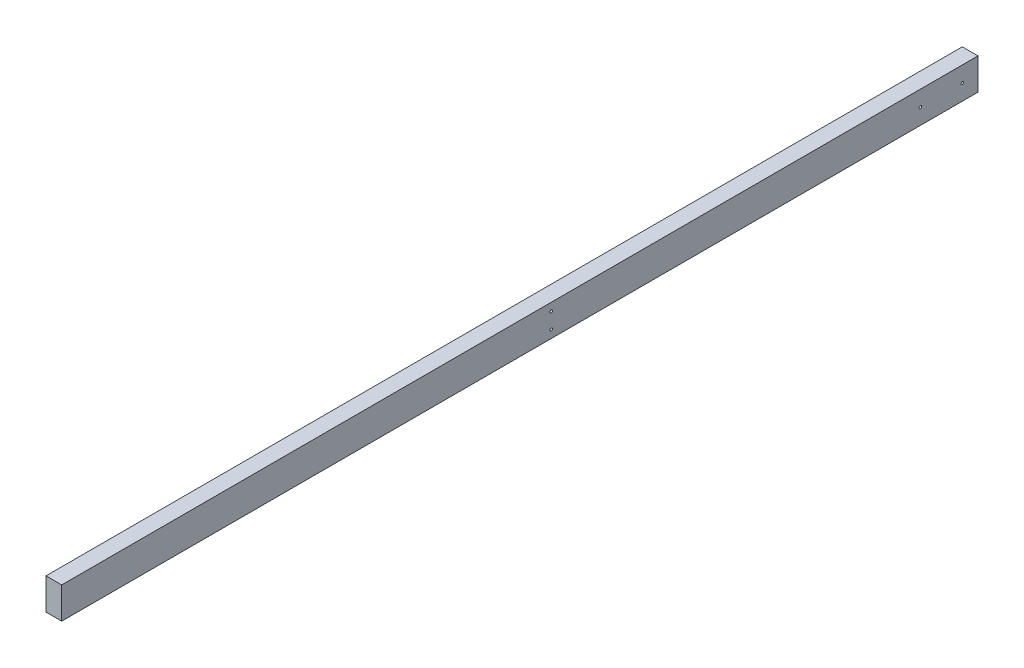
ISO-10303-21;
HEADER;
FILE_DESCRIPTION(('STEP AP214'),'2;1');
FILE_NAME('part.step','',(''),(''),'','','');
FILE_SCHEMA(('AUTOMOTIVE_DESIGN { 1 0 10303 214 1 1 1 1 }'));
ENDSEC;
DATA;
#1=APPLICATION_CONTEXT('core data for automotive mechanical design processes');
#2=APPLICATION_PROTOCOL_DEFINITION('international standard','automotive_design',2000,#1);
#3=PRODUCT_CONTEXT('',#1,'mechanical');
#4=PRODUCT('Part','Part','',(#3));
#5=PRODUCT_RELATED_PRODUCT_CATEGORY('part','',(#4));
#6=PRODUCT_DEFINITION_FORMATION('','',#4);
#7=PRODUCT_DEFINITION_CONTEXT('part definition',#1,'design');
#8=PRODUCT_DEFINITION('design','',#6,#7);
#9=PRODUCT_DEFINITION_SHAPE('','',#8);
#10=(LENGTH_UNIT() NAMED_UNIT(*) SI_UNIT(.MILLI.,.METRE.));
#11=(NAMED_UNIT(*) PLANE_ANGLE_UNIT() SI_UNIT($,.RADIAN.));
#12=(NAMED_UNIT(*) SI_UNIT($,.STERADIAN.) SOLID_ANGLE_UNIT());
#13=UNCERTAINTY_MEASURE_WITH_UNIT(LENGTH_MEASURE(1.E-05),#10,'distance_accuracy_value','');
#14=(GEOMETRIC_REPRESENTATION_CONTEXT(3) GLOBAL_UNCERTAINTY_ASSIGNED_CONTEXT((#13)) GLOBAL_UNIT_ASSIGNED_CONTEXT((#10,
#11,#12)) REPRESENTATION_CONTEXT('',''));
#15=CARTESIAN_POINT('',(0.,0.,0.));
#16=DIRECTION('',(0.,0.,1.));
#17=DIRECTION('',(1.,0.,0.));
#18=AXIS2_PLACEMENT_3D('',#15,#16,#17);
#19=CARTESIAN_POINT('',(-549.275,0.,-44.45));
#20=DIRECTION('',(1.,0.,0.));
#21=DIRECTION('',(0.,0.,-1.));
#22=AXIS2_PLACEMENT_3D('',#19,#20,#21);
#23=PLANE('',#22);
#24=CARTESIAN_POINT('',(-549.275,9.525,473.075));
#25=DIRECTION('',(-1.,0.,0.));
#26=DIRECTION('',(0.,0.,1.));
#27=AXIS2_PLACEMENT_3D('',#24,#25,#26);
#28=CIRCLE('',#27,1.5875);
#29=CARTESIAN_POINT('',(-549.275,9.525,474.6625));
#30=VERTEX_POINT('',#29);
#31=EDGE_CURVE('E89',#30,#30,#28,.T.);
#32=ORIENTED_EDGE('',*,*,#31,.T.);
#33=EDGE_LOOP('',(#32));
#34=FACE_BOUND('',#33,.T.);
#35=CARTESIAN_POINT('',(-549.275,28.575,473.075));
#36=DIRECTION('',(-1.,0.,0.));
#37=DIRECTION('',(0.,0.,1.));
#38=AXIS2_PLACEMENT_3D('',#35,#36,#37);
#39=CIRCLE('',#38,1.5875);
#40=CARTESIAN_POINT('',(-549.275,28.575,474.6625));
#41=VERTEX_POINT('',#40);
#42=EDGE_CURVE('E93',#41,#41,#39,.T.);
#43=ORIENTED_EDGE('',*,*,#42,.T.);
#44=EDGE_LOOP('',(#43));
#45=FACE_BOUND('',#44,.T.);
#46=CARTESIAN_POINT('',(-549.275,19.05,25.4));
#47=DIRECTION('',(-1.,0.,0.));
#48=DIRECTION('',(0.,0.,1.));
#49=AXIS2_PLACEMENT_3D('',#46,#47,#48);
#50=CIRCLE('',#49,1.5875);
#51=CARTESIAN_POINT('',(-549.275,19.05,26.9875));
#52=VERTEX_POINT('',#51);
#53=EDGE_CURVE('E95',#52,#52,#50,.T.);
#54=ORIENTED_EDGE('',*,*,#53,.T.);
#55=EDGE_LOOP('',(#54));
#56=FACE_BOUND('',#55,.T.);
#57=CARTESIAN_POINT('',(-549.275,19.05,-25.4));
#58=DIRECTION('',(-1.,0.,0.));
#59=DIRECTION('',(0.,0.,1.));
#60=AXIS2_PLACEMENT_3D('',#57,#58,#59);
#61=CIRCLE('',#60,1.5875);
#62=CARTESIAN_POINT('',(-549.275,19.05,-23.8125));
#63=VERTEX_POINT('',#62);
#64=EDGE_CURVE('E19',#63,#63,#61,.T.);
#65=ORIENTED_EDGE('',*,*,#64,.T.);
#66=EDGE_LOOP('',(#65));
#67=FACE_BOUND('',#66,.T.);
#68=DIRECTION('',(0.,1.,0.));
#69=VECTOR('',#68,1.);
#70=CARTESIAN_POINT('',(-549.275,0.,1066.8));
#71=LINE('',#70,#69);
#72=CARTESIAN_POINT('',(-549.275,0.,1066.8));
#73=VERTEX_POINT('',#72);
#74=CARTESIAN_POINT('',(-549.275,38.1,1066.8));
#75=VERTEX_POINT('',#74);
#76=EDGE_CURVE('E59',#73,#75,#71,.T.);
#77=ORIENTED_EDGE('',*,*,#76,.F.);
#78=DIRECTION('',(0.,0.,-1.));
#79=VECTOR('',#78,1.);
#80=CARTESIAN_POINT('',(-549.275,0.,0.));
#81=LINE('',#80,#79);
#82=CARTESIAN_POINT('',(-549.275,0.,-44.45));
#83=VERTEX_POINT('',#82);
#84=EDGE_CURVE('E100',#83,#73,#81,.F.);
#85=ORIENTED_EDGE('',*,*,#84,.F.);
#86=DIRECTION('',(0.,1.,0.));
#87=VECTOR('',#86,1.);
#88=CARTESIAN_POINT('',(-549.275,0.,-44.45));
#89=LINE('',#88,#87);
#90=CARTESIAN_POINT('',(-549.275,38.1,-44.45));
#91=VERTEX_POINT('',#90);
#92=EDGE_CURVE('E69',#91,#83,#89,.F.);
#93=ORIENTED_EDGE('',*,*,#92,.F.);
#94=DIRECTION('',(0.,0.,1.));
#95=VECTOR('',#94,1.);
#96=CARTESIAN_POINT('',(-549.275,38.1,0.));
#97=LINE('',#96,#95);
#98=EDGE_CURVE('E54',#75,#91,#97,.F.);
#99=ORIENTED_EDGE('',*,*,#98,.F.);
#100=EDGE_LOOP('',(#77,#85,#93,#99));
#101=FACE_BOUND('',#100,.T.);
#102=ADVANCED_FACE('F16',(#34,#45,#56,#67,#101),#23,.T.);
#103=CARTESIAN_POINT('',(-549.275,0.,1066.8));
#104=DIRECTION('',(0.,0.,1.));
#105=DIRECTION('',(1.,0.,0.));
#106=AXIS2_PLACEMENT_3D('',#103,#104,#105);
#107=PLANE('',#106);
#108=DIRECTION('',(0.,1.,0.));
#109=VECTOR('',#108,1.);
#110=CARTESIAN_POINT('',(-568.325,0.,1066.8));
#111=LINE('',#110,#109);
#112=CARTESIAN_POINT('',(-568.325,0.,1066.8));
#113=VERTEX_POINT('',#112);
#114=CARTESIAN_POINT('',(-568.325,38.1,1066.8));
#115=VERTEX_POINT('',#114);
#116=EDGE_CURVE('E92',#113,#115,#111,.T.);
#117=ORIENTED_EDGE('',*,*,#116,.F.);
#118=DIRECTION('',(1.,0.,0.));
#119=VECTOR('',#118,1.);
#120=CARTESIAN_POINT('',(0.,0.,1066.8));
#121=LINE('',#120,#119);
#122=EDGE_CURVE('E64',#73,#113,#121,.F.);
#123=ORIENTED_EDGE('',*,*,#122,.F.);
#124=ORIENTED_EDGE('',*,*,#76,.T.);
#125=DIRECTION('',(1.,0.,0.));
#126=VECTOR('',#125,1.);
#127=CARTESIAN_POINT('',(0.,38.1,1066.8));
#128=LINE('',#127,#126);
#129=EDGE_CURVE('E61',#115,#75,#128,.T.);
#130=ORIENTED_EDGE('',*,*,#129,.F.);
#131=EDGE_LOOP('',(#117,#123,#124,#130));
#132=FACE_BOUND('',#131,.T.);
#133=ADVANCED_FACE('F60',(#132),#107,.T.);
#134=CARTESIAN_POINT('',(0.,38.1,0.));
#135=DIRECTION('',(0.,1.,0.));
#136=DIRECTION('',(0.,0.,1.));
#137=AXIS2_PLACEMENT_3D('',#134,#135,#136);
#138=PLANE('',#137);
#139=ORIENTED_EDGE('',*,*,#129,.T.);
#140=ORIENTED_EDGE('',*,*,#98,.T.);
#141=DIRECTION('',(-1.,0.,0.));
#142=VECTOR('',#141,1.);
#143=CARTESIAN_POINT('',(-568.325,38.1,-44.45));
#144=LINE('',#143,#142);
#145=CARTESIAN_POINT('',(-568.325,38.1,-44.45));
#146=VERTEX_POINT('',#145);
#147=EDGE_CURVE('E71',#146,#91,#144,.F.);
#148=ORIENTED_EDGE('',*,*,#147,.F.);
#149=DIRECTION('',(0.,0.,1.));
#150=VECTOR('',#149,1.);
#151=CARTESIAN_POINT('',(-568.325,38.1,1066.8));
#152=LINE('',#151,#150);
#153=EDGE_CURVE('E75',#115,#146,#152,.F.);
#154=ORIENTED_EDGE('',*,*,#153,.F.);
#155=EDGE_LOOP('',(#139,#140,#148,#154));
#156=FACE_BOUND('',#155,.T.);
#157=ADVANCED_FACE('F73',(#156),#138,.T.);
#158=CARTESIAN_POINT('',(-568.325,0.,-44.45));
#159=DIRECTION('',(0.,0.,-1.));
#160=DIRECTION('',(-1.,0.,0.));
#161=AXIS2_PLACEMENT_3D('',#158,#159,#160);
#162=PLANE('',#161);
#163=ORIENTED_EDGE('',*,*,#92,.T.);
#164=DIRECTION('',(1.,0.,0.));
#165=VECTOR('',#164,1.);
#166=CARTESIAN_POINT('',(0.,0.,-44.45));
#167=LINE('',#166,#165);
#168=CARTESIAN_POINT('',(-568.325,0.,-44.45));
#169=VERTEX_POINT('',#168);
#170=EDGE_CURVE('E34',#169,#83,#167,.T.);
#171=ORIENTED_EDGE('',*,*,#170,.F.);
#172=DIRECTION('',(0.,1.,0.));
#173=VECTOR('',#172,1.);
#174=CARTESIAN_POINT('',(-568.325,0.,-44.4500000000001));
#175=LINE('',#174,#173);
#176=EDGE_CURVE('E112',#146,#169,#175,.F.);
#177=ORIENTED_EDGE('',*,*,#176,.F.);
#178=ORIENTED_EDGE('',*,*,#147,.T.);
#179=EDGE_LOOP('',(#163,#171,#177,#178));
#180=FACE_BOUND('',#179,.T.);
#181=ADVANCED_FACE('F110',(#180),#162,.T.);
#182=CARTESIAN_POINT('',(0.,0.,0.));
#183=DIRECTION('',(0.,-1.,0.));
#184=DIRECTION('',(0.,0.,-1.));
#185=AXIS2_PLACEMENT_3D('',#182,#183,#184);
#186=PLANE('',#185);
#187=ORIENTED_EDGE('',*,*,#170,.T.);
#188=ORIENTED_EDGE('',*,*,#84,.T.);
#189=ORIENTED_EDGE('',*,*,#122,.T.);
#190=DIRECTION('',(0.,0.,1.));
#191=VECTOR('',#190,1.);
#192=CARTESIAN_POINT('',(-568.325,0.,1066.8));
#193=LINE('',#192,#191);
#194=EDGE_CURVE('E88',#169,#113,#193,.T.);
#195=ORIENTED_EDGE('',*,*,#194,.F.);
#196=EDGE_LOOP('',(#187,#188,#189,#195));
#197=FACE_BOUND('',#196,.T.);
#198=ADVANCED_FACE('F118',(#197),#186,.T.);
#199=CARTESIAN_POINT('',(-568.325,19.05,-25.4));
#200=DIRECTION('',(-1.,0.,0.));
#201=DIRECTION('',(0.,0.,1.));
#202=AXIS2_PLACEMENT_3D('',#199,#200,#201);
#203=CYLINDRICAL_SURFACE('',#202,1.5875);
#204=CARTESIAN_POINT('',(-568.325,19.05,-25.4));
#205=DIRECTION('',(-1.,0.,0.));
#206=DIRECTION('',(0.,0.,1.));
#207=AXIS2_PLACEMENT_3D('',#204,#205,#206);
#208=CIRCLE('',#207,1.5875);
#209=CARTESIAN_POINT('',(-568.325,19.05,-23.8125));
#210=VERTEX_POINT('',#209);
#211=EDGE_CURVE('E85',#210,#210,#208,.F.);
#212=ORIENTED_EDGE('',*,*,#211,.F.);
#213=EDGE_LOOP('',(#212));
#214=FACE_BOUND('',#213,.T.);
#215=ORIENTED_EDGE('',*,*,#64,.F.);
#216=EDGE_LOOP('',(#215));
#217=FACE_BOUND('',#216,.T.);
#218=ADVANCED_FACE('F120',(#214,#217),#203,.F.);
#219=CARTESIAN_POINT('',(-568.325,19.05,25.4));
#220=DIRECTION('',(-1.,0.,0.));
#221=DIRECTION('',(0.,0.,1.));
#222=AXIS2_PLACEMENT_3D('',#219,#220,#221);
#223=CYLINDRICAL_SURFACE('',#222,1.5875);
#224=CARTESIAN_POINT('',(-568.325,19.05,25.4));
#225=DIRECTION('',(-1.,0.,0.));
#226=DIRECTION('',(0.,0.,1.));
#227=AXIS2_PLACEMENT_3D('',#224,#225,#226);
#228=CIRCLE('',#227,1.5875);
#229=CARTESIAN_POINT('',(-568.325,19.05,26.9875));
#230=VERTEX_POINT('',#229);
#231=EDGE_CURVE('E82',#230,#230,#228,.F.);
#232=ORIENTED_EDGE('',*,*,#231,.F.);
#233=EDGE_LOOP('',(#232));
#234=FACE_BOUND('',#233,.T.);
#235=ORIENTED_EDGE('',*,*,#53,.F.);
#236=EDGE_LOOP('',(#235));
#237=FACE_BOUND('',#236,.T.);
#238=ADVANCED_FACE('F127',(#234,#237),#223,.F.);
#239=CARTESIAN_POINT('',(-568.325,28.575,473.075));
#240=DIRECTION('',(-1.,0.,0.));
#241=DIRECTION('',(0.,0.,1.));
#242=AXIS2_PLACEMENT_3D('',#239,#240,#241);
#243=CYLINDRICAL_SURFACE('',#242,1.5875);
#244=CARTESIAN_POINT('',(-568.325,28.575,473.075));
#245=DIRECTION('',(-1.,0.,0.));
#246=DIRECTION('',(0.,0.,1.));
#247=AXIS2_PLACEMENT_3D('',#244,#245,#246);
#248=CIRCLE('',#247,1.5875);
#249=CARTESIAN_POINT('',(-568.325,28.575,474.6625));
#250=VERTEX_POINT('',#249);
#251=EDGE_CURVE('E25',#250,#250,#248,.F.);
#252=ORIENTED_EDGE('',*,*,#251,.F.);
#253=EDGE_LOOP('',(#252));
#254=FACE_BOUND('',#253,.T.);
#255=ORIENTED_EDGE('',*,*,#42,.F.);
#256=EDGE_LOOP('',(#255));
#257=FACE_BOUND('',#256,.T.);
#258=ADVANCED_FACE('F138',(#254,#257),#243,.F.);
#259=CARTESIAN_POINT('',(-568.325,9.525,473.075));
#260=DIRECTION('',(-1.,0.,0.));
#261=DIRECTION('',(0.,0.,1.));
#262=AXIS2_PLACEMENT_3D('',#259,#260,#261);
#263=CYLINDRICAL_SURFACE('',#262,1.5875);
#264=CARTESIAN_POINT('',(-568.325,9.525,473.075));
#265=DIRECTION('',(-1.,0.,0.));
#266=DIRECTION('',(0.,0.,1.));
#267=AXIS2_PLACEMENT_3D('',#264,#265,#266);
#268=CIRCLE('',#267,1.5875);
#269=CARTESIAN_POINT('',(-568.325,9.525,474.6625));
#270=VERTEX_POINT('',#269);
#271=EDGE_CURVE('E11',#270,#270,#268,.F.);
#272=ORIENTED_EDGE('',*,*,#271,.F.);
#273=EDGE_LOOP('',(#272));
#274=FACE_BOUND('',#273,.T.);
#275=ORIENTED_EDGE('',*,*,#31,.F.);
#276=EDGE_LOOP('',(#275));
#277=FACE_BOUND('',#276,.T.);
#278=ADVANCED_FACE('F132',(#274,#277),#263,.F.);
#279=CARTESIAN_POINT('',(-568.325,0.,1066.8));
#280=DIRECTION('',(-1.,0.,0.));
#281=DIRECTION('',(0.,0.,1.));
#282=AXIS2_PLACEMENT_3D('',#279,#280,#281);
#283=PLANE('',#282);
#284=ORIENTED_EDGE('',*,*,#271,.T.);
#285=EDGE_LOOP('',(#284));
#286=FACE_BOUND('',#285,.T.);
#287=ORIENTED_EDGE('',*,*,#251,.T.);
#288=EDGE_LOOP('',(#287));
#289=FACE_BOUND('',#288,.T.);
#290=ORIENTED_EDGE('',*,*,#231,.T.);
#291=EDGE_LOOP('',(#290));
#292=FACE_BOUND('',#291,.T.);
#293=ORIENTED_EDGE('',*,*,#211,.T.);
#294=EDGE_LOOP('',(#293));
#295=FACE_BOUND('',#294,.T.);
#296=ORIENTED_EDGE('',*,*,#176,.T.);
#297=ORIENTED_EDGE('',*,*,#194,.T.);
#298=ORIENTED_EDGE('',*,*,#116,.T.);
#299=ORIENTED_EDGE('',*,*,#153,.T.);
#300=EDGE_LOOP('',(#296,#297,#298,#299));
#301=FACE_BOUND('',#300,.T.);
#302=ADVANCED_FACE('F116',(#286,#289,#292,#295,#301),#283,.T.);
#303=CLOSED_SHELL('',(#102,#133,#157,#181,#198,#218,#238,#258,#278,#302));
#304=MANIFOLD_SOLID_BREP('B1',#303);
#305=ADVANCED_BREP_SHAPE_REPRESENTATION('',(#18,#304),#14);
#306=SHAPE_DEFINITION_REPRESENTATION(#9,#305);
ENDSEC;
END-ISO-10303-21;
